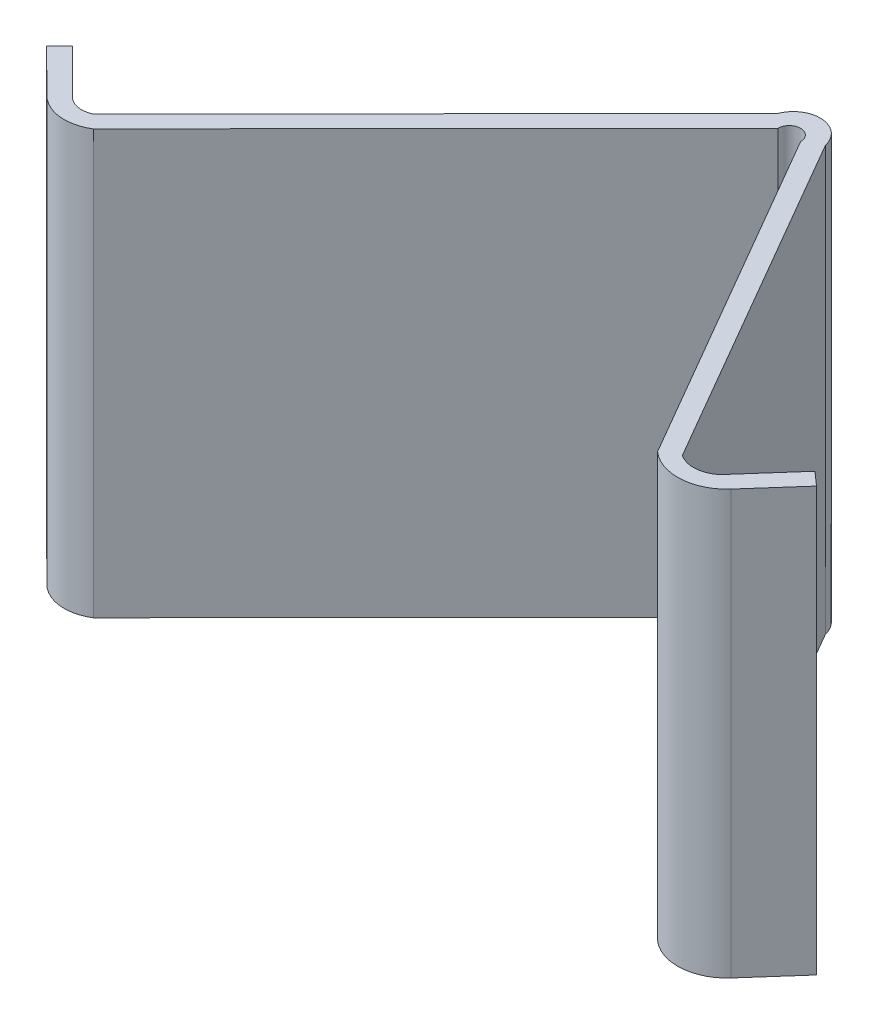
ISO-10303-21;
HEADER;
FILE_DESCRIPTION(('STEP AP214'),'2;1');
FILE_NAME('part.step','',(''),(''),'','','');
FILE_SCHEMA(('AUTOMOTIVE_DESIGN { 1 0 10303 214 1 1 1 1 }'));
ENDSEC;
DATA;
#1=APPLICATION_CONTEXT('core data for automotive mechanical design processes');
#2=APPLICATION_PROTOCOL_DEFINITION('international standard','automotive_design',2000,#1);
#3=PRODUCT_CONTEXT('',#1,'mechanical');
#4=PRODUCT('Part','Part','',(#3));
#5=PRODUCT_RELATED_PRODUCT_CATEGORY('part','',(#4));
#6=PRODUCT_DEFINITION_FORMATION('','',#4);
#7=PRODUCT_DEFINITION_CONTEXT('part definition',#1,'design');
#8=PRODUCT_DEFINITION('design','',#6,#7);
#9=PRODUCT_DEFINITION_SHAPE('','',#8);
#10=(LENGTH_UNIT() NAMED_UNIT(*) SI_UNIT(.MILLI.,.METRE.));
#11=(NAMED_UNIT(*) PLANE_ANGLE_UNIT() SI_UNIT($,.RADIAN.));
#12=(NAMED_UNIT(*) SI_UNIT($,.STERADIAN.) SOLID_ANGLE_UNIT());
#13=UNCERTAINTY_MEASURE_WITH_UNIT(LENGTH_MEASURE(1.E-05),#10,'distance_accuracy_value','');
#14=(GEOMETRIC_REPRESENTATION_CONTEXT(3) GLOBAL_UNCERTAINTY_ASSIGNED_CONTEXT((#13)) GLOBAL_UNIT_ASSIGNED_CONTEXT((#10,
#11,#12)) REPRESENTATION_CONTEXT('',''));
#15=CARTESIAN_POINT('',(0.,0.,0.));
#16=DIRECTION('',(0.,0.,1.));
#17=DIRECTION('',(1.,0.,0.));
#18=AXIS2_PLACEMENT_3D('',#15,#16,#17);
#19=CARTESIAN_POINT('',(-1.37972752963532,70.,-1.37563338266311));
#20=DIRECTION('',(-0.708156678158469,0.,-0.7060553230304));
#21=DIRECTION('',(-0.7060553230304,0.,0.708156678158469));
#22=AXIS2_PLACEMENT_3D('',#19,#20,#21);
#23=PLANE('',#22);
#24=DIRECTION('',(0.7060553230304,0.,-0.708156678158469));
#25=VECTOR('',#24,1.);
#26=CARTESIAN_POINT('',(-1.37972752963532,0.,-1.37563338266311));
#27=LINE('',#26,#25);
#28=CARTESIAN_POINT('',(-43.3633685392197,0.,40.73295893945));
#29=VERTEX_POINT('',#28);
#30=CARTESIAN_POINT('',(13.1210573032123,0.,-15.9195753132276));
#31=VERTEX_POINT('',#30);
#32=EDGE_CURVE('E478',#29,#31,#27,.T.);
#33=ORIENTED_EDGE('',*,*,#32,.T.);
#34=DIRECTION('',(0.,-1.,0.));
#35=VECTOR('',#34,1.);
#36=CARTESIAN_POINT('',(13.1210573032123,70.,-15.9195753132276));
#37=LINE('',#36,#35);
#38=CARTESIAN_POINT('',(13.1210573032123,70.,-15.9195753132276));
#39=VERTEX_POINT('',#38);
#40=EDGE_CURVE('E457',#39,#31,#37,.T.);
#41=ORIENTED_EDGE('',*,*,#40,.F.);
#42=DIRECTION('',(0.7060553230304,0.,-0.708156678158469));
#43=VECTOR('',#42,1.);
#44=CARTESIAN_POINT('',(-1.37972752963532,70.,-1.37563338266311));
#45=LINE('',#44,#43);
#46=CARTESIAN_POINT('',(-43.3633685392197,70.,40.73295893945));
#47=VERTEX_POINT('',#46);
#48=EDGE_CURVE('E477',#47,#39,#45,.T.);
#49=ORIENTED_EDGE('',*,*,#48,.F.);
#50=DIRECTION('',(0.,-1.,0.));
#51=VECTOR('',#50,1.);
#52=CARTESIAN_POINT('',(-43.3633685392197,70.,40.73295893945));
#53=LINE('',#52,#51);
#54=EDGE_CURVE('E282',#47,#29,#53,.T.);
#55=ORIENTED_EDGE('',*,*,#54,.T.);
#56=EDGE_LOOP('',(#33,#41,#49,#55));
#57=FACE_BOUND('',#56,.T.);
#58=ADVANCED_FACE('F263',(#57),#23,.F.);
#59=CARTESIAN_POINT('',(-3.50419756411074,70.,-3.49379935175431));
#60=DIRECTION('',(-0.708156678158469,0.,-0.7060553230304));
#61=DIRECTION('',(-0.7060553230304,0.,0.708156678158469));
#62=AXIS2_PLACEMENT_3D('',#59,#60,#61);
#63=PLANE('',#62);
#64=DIRECTION('',(0.7060553230304,0.,-0.708156678158469));
#65=VECTOR('',#64,1.);
#66=CARTESIAN_POINT('',(-3.50419756411074,0.,-3.49379935175431));
#67=LINE('',#66,#65);
#68=CARTESIAN_POINT('',(-45.4878385736951,0.,38.6147929703588));
#69=VERTEX_POINT('',#68);
#70=CARTESIAN_POINT('',(10.9965872687369,0.,-18.0377412823188));
#71=VERTEX_POINT('',#70);
#72=EDGE_CURVE('E454',#69,#71,#67,.T.);
#73=ORIENTED_EDGE('',*,*,#72,.F.);
#74=DIRECTION('',(0.,-1.,0.));
#75=VECTOR('',#74,1.);
#76=CARTESIAN_POINT('',(-45.4878385736951,70.,38.6147929703588));
#77=LINE('',#76,#75);
#78=CARTESIAN_POINT('',(-45.4878385736951,70.,38.6147929703588));
#79=VERTEX_POINT('',#78);
#80=EDGE_CURVE('E273',#79,#69,#77,.T.);
#81=ORIENTED_EDGE('',*,*,#80,.F.);
#82=DIRECTION('',(0.7060553230304,0.,-0.708156678158469));
#83=VECTOR('',#82,1.);
#84=CARTESIAN_POINT('',(-3.50419756411074,70.,-3.49379935175431));
#85=LINE('',#84,#83);
#86=CARTESIAN_POINT('',(10.9965872687369,70.,-18.0377412823188));
#87=VERTEX_POINT('',#86);
#88=EDGE_CURVE('E480',#79,#87,#85,.T.);
#89=ORIENTED_EDGE('',*,*,#88,.T.);
#90=DIRECTION('',(0.,-1.,0.));
#91=VECTOR('',#90,1.);
#92=CARTESIAN_POINT('',(10.9965872687369,70.,-18.0377412823188));
#93=LINE('',#92,#91);
#94=EDGE_CURVE('E12',#87,#71,#93,.T.);
#95=ORIENTED_EDGE('',*,*,#94,.T.);
#96=EDGE_LOOP('',(#73,#81,#89,#95));
#97=FACE_BOUND('',#96,.T.);
#98=ADVANCED_FACE('F499',(#97),#63,.T.);
#99=CARTESIAN_POINT('',(-47.1014105514273,70.,34.8767509581333));
#100=DIRECTION('',(0.,-1.,0.));
#101=DIRECTION('',(0.,0.,-1.));
#102=AXIS2_PLACEMENT_3D('',#99,#100,#101);
#103=CYLINDRICAL_SURFACE('',#102,6.94752689850618);
#104=CARTESIAN_POINT('',(-47.1014105514273,0.,34.8767509581333));
#105=DIRECTION('',(0.,1.,0.));
#106=DIRECTION('',(0.,0.,1.));
#107=AXIS2_PLACEMENT_3D('',#104,#105,#106);
#108=CIRCLE('',#107,6.94752689850618);
#109=CARTESIAN_POINT('',(-52.0067489000145,0.,39.7966885279961));
#110=VERTEX_POINT('',#109);
#111=EDGE_CURVE('E481',#29,#110,#108,.F.);
#112=ORIENTED_EDGE('',*,*,#111,.F.);
#113=ORIENTED_EDGE('',*,*,#54,.F.);
#114=CARTESIAN_POINT('',(-47.1014105514273,70.,34.8767509581333));
#115=DIRECTION('',(0.,1.,0.));
#116=DIRECTION('',(0.,0.,1.));
#117=AXIS2_PLACEMENT_3D('',#114,#115,#116);
#118=CIRCLE('',#117,6.94752689850618);
#119=CARTESIAN_POINT('',(-52.0067489000145,70.,39.7966885279961));
#120=VERTEX_POINT('',#119);
#121=EDGE_CURVE('E489',#47,#120,#118,.F.);
#122=ORIENTED_EDGE('',*,*,#121,.T.);
#123=DIRECTION('',(0.,-1.,0.));
#124=VECTOR('',#123,1.);
#125=CARTESIAN_POINT('',(-52.0067489000145,70.,39.7966885279961));
#126=LINE('',#125,#124);
#127=EDGE_CURVE('E474',#120,#110,#126,.T.);
#128=ORIENTED_EDGE('',*,*,#127,.T.);
#129=EDGE_LOOP('',(#112,#113,#122,#128));
#130=FACE_BOUND('',#129,.T.);
#131=ADVANCED_FACE('F526',(#130),#103,.T.);
#132=CARTESIAN_POINT('',(-47.0795581582017,70.,35.301794509272));
#133=DIRECTION('',(0.,-1.,0.));
#134=DIRECTION('',(0.,0.,-1.));
#135=AXIS2_PLACEMENT_3D('',#132,#133,#134);
#136=CYLINDRICAL_SURFACE('',#135,3.67553125940526);
#137=CARTESIAN_POINT('',(-47.0795581582017,0.,35.301794509272));
#138=DIRECTION('',(0.,1.,0.));
#139=DIRECTION('',(0.,0.,1.));
#140=AXIS2_PLACEMENT_3D('',#137,#138,#139);
#141=CIRCLE('',#140,3.67553125940526);
#142=CARTESIAN_POINT('',(-49.8885829309233,0.,37.6722184935206));
#143=VERTEX_POINT('',#142);
#144=EDGE_CURVE('E484',#143,#69,#141,.T.);
#145=ORIENTED_EDGE('',*,*,#144,.F.);
#146=DIRECTION('',(0.,-1.,0.));
#147=VECTOR('',#146,1.);
#148=CARTESIAN_POINT('',(-49.8885829309233,70.,37.6722184935206));
#149=LINE('',#148,#147);
#150=CARTESIAN_POINT('',(-49.8885829309233,70.,37.6722184935206));
#151=VERTEX_POINT('',#150);
#152=EDGE_CURVE('E472',#151,#143,#149,.T.);
#153=ORIENTED_EDGE('',*,*,#152,.F.);
#154=CARTESIAN_POINT('',(-47.0795581582017,70.,35.301794509272));
#155=DIRECTION('',(0.,1.,0.));
#156=DIRECTION('',(0.,0.,1.));
#157=AXIS2_PLACEMENT_3D('',#154,#155,#156);
#158=CIRCLE('',#157,3.67553125940526);
#159=EDGE_CURVE('E491',#151,#79,#158,.T.);
#160=ORIENTED_EDGE('',*,*,#159,.T.);
#161=ORIENTED_EDGE('',*,*,#80,.T.);
#162=EDGE_LOOP('',(#145,#153,#160,#161));
#163=FACE_BOUND('',#162,.T.);
#164=ADVANCED_FACE('F513',(#163),#136,.F.);
#165=CARTESIAN_POINT('',(0.,0.,0.));
#166=DIRECTION('',(0.,1.,0.));
#167=DIRECTION('',(0.,0.,1.));
#168=AXIS2_PLACEMENT_3D('',#165,#166,#167);
#169=PLANE('',#168);
#170=ORIENTED_EDGE('',*,*,#144,.T.);
#171=ORIENTED_EDGE('',*,*,#72,.T.);
#172=CARTESIAN_POINT('',(15.1528221863756,0.,-16.4480817857646));
#173=DIRECTION('',(0.,1.,0.));
#174=DIRECTION('',(0.,0.,1.));
#175=AXIS2_PLACEMENT_3D('',#172,#173,#174);
#176=CIRCLE('',#175,4.44986584130173);
#177=CARTESIAN_POINT('',(19.4944801510169,0.,-17.4234340932158));
#178=VERTEX_POINT('',#177);
#179=EDGE_CURVE('E461',#178,#71,#176,.T.);
#180=ORIENTED_EDGE('',*,*,#179,.F.);
#181=DIRECTION('',(0.501286259996058,0.,0.865281506527884));
#182=VECTOR('',#181,1.);
#183=CARTESIAN_POINT('',(22.1532324220866,0.,-12.83410190084));
#184=LINE('',#183,#182);
#185=CARTESIAN_POINT('',(52.0780870507607,0.,38.8198638310967));
#186=VERTEX_POINT('',#185);
#187=EDGE_CURVE('E432',#178,#186,#184,.T.);
#188=ORIENTED_EDGE('',*,*,#187,.T.);
#189=CARTESIAN_POINT('',(54.742084179433,0.,34.7879503258305));
#190=DIRECTION('',(0.,1.,0.));
#191=DIRECTION('',(0.,0.,1.));
#192=AXIS2_PLACEMENT_3D('',#189,#190,#191);
#193=CIRCLE('',#192,4.83251561979071);
#194=CARTESIAN_POINT('',(58.6689987900577,0.,37.6044284202567));
#195=VERTEX_POINT('',#194);
#196=EDGE_CURVE('E392',#186,#195,#193,.T.);
#197=ORIENTED_EDGE('',*,*,#196,.T.);
#198=DIRECTION('',(0.662657885771109,0.,-0.748922243243826));
#199=VECTOR('',#198,1.);
#200=CARTESIAN_POINT('',(58.6689987900577,0.,37.6044284202567));
#201=LINE('',#200,#199);
#202=CARTESIAN_POINT('',(65.2955776477688,0.,30.1152059878184));
#203=VERTEX_POINT('',#202);
#204=EDGE_CURVE('E376',#195,#203,#201,.T.);
#205=ORIENTED_EDGE('',*,*,#204,.T.);
#206=DIRECTION('',(0.748922243243827,0.,0.662657885771107));
#207=VECTOR('',#206,1.);
#208=CARTESIAN_POINT('',(65.2955776477688,0.,30.1152059878184));
#209=LINE('',#208,#207);
#210=CARTESIAN_POINT('',(67.5423443775003,0.,32.1031796451317));
#211=VERTEX_POINT('',#210);
#212=EDGE_CURVE('E383',#203,#211,#209,.T.);
#213=ORIENTED_EDGE('',*,*,#212,.T.);
#214=DIRECTION('',(0.662657885771111,0.,-0.748922243243824));
#215=VECTOR('',#214,1.);
#216=CARTESIAN_POINT('',(60.9157655197892,0.,39.59240207757));
#217=LINE('',#216,#215);
#218=CARTESIAN_POINT('',(60.9157655197892,0.,39.59240207757));
#219=VERTEX_POINT('',#218);
#220=EDGE_CURVE('E386',#219,#211,#217,.T.);
#221=ORIENTED_EDGE('',*,*,#220,.F.);
#222=CARTESIAN_POINT('',(54.8312610227236,0.,34.2087391908511));
#223=DIRECTION('',(0.,1.,0.));
#224=DIRECTION('',(0.,0.,1.));
#225=AXIS2_PLACEMENT_3D('',#222,#223,#224);
#226=CIRCLE('',#225,8.12434742318689);
#227=CARTESIAN_POINT('',(49.4822425311771,0.,40.3237226110849));
#228=VERTEX_POINT('',#227);
#229=EDGE_CURVE('E436',#228,#219,#226,.T.);
#230=ORIENTED_EDGE('',*,*,#229,.F.);
#231=DIRECTION('',(0.501286259996058,0.,0.865281506527884));
#232=VECTOR('',#231,1.);
#233=CARTESIAN_POINT('',(19.5573879025029,0.,-11.3302431208518));
#234=LINE('',#233,#232);
#235=CARTESIAN_POINT('',(16.8986356314333,0.,-15.9195753132276));
#236=VERTEX_POINT('',#235);
#237=EDGE_CURVE('E403',#236,#228,#234,.T.);
#238=ORIENTED_EDGE('',*,*,#237,.F.);
#239=CARTESIAN_POINT('',(15.0098464673228,0.,-15.9195753132276));
#240=DIRECTION('',(0.,1.,0.));
#241=DIRECTION('',(0.,0.,1.));
#242=AXIS2_PLACEMENT_3D('',#239,#240,#241);
#243=CIRCLE('',#242,1.88878916411049);
#244=EDGE_CURVE('E424',#236,#31,#243,.T.);
#245=ORIENTED_EDGE('',*,*,#244,.T.);
#246=ORIENTED_EDGE('',*,*,#32,.F.);
#247=ORIENTED_EDGE('',*,*,#111,.T.);
#248=DIRECTION('',(-0.708156678158472,0.,-0.706055323030397));
#249=VECTOR('',#248,1.);
#250=CARTESIAN_POINT('',(-52.0067489000145,0.,39.796688527996));
#251=LINE('',#250,#249);
#252=CARTESIAN_POINT('',(-59.0883156815992,0.,32.7361352976921));
#253=VERTEX_POINT('',#252);
#254=EDGE_CURVE('E407',#110,#253,#251,.T.);
#255=ORIENTED_EDGE('',*,*,#254,.T.);
#256=DIRECTION('',(0.706055323030398,0.,-0.708156678158471));
#257=VECTOR('',#256,1.);
#258=CARTESIAN_POINT('',(-59.0883156815992,0.,32.7361352976921));
#259=LINE('',#258,#257);
#260=CARTESIAN_POINT('',(-56.970149712508,0.,30.6116652632167));
#261=VERTEX_POINT('',#260);
#262=EDGE_CURVE('E411',#253,#261,#259,.T.);
#263=ORIENTED_EDGE('',*,*,#262,.T.);
#264=DIRECTION('',(-0.708156678158472,0.,-0.706055323030397));
#265=VECTOR('',#264,1.);
#266=CARTESIAN_POINT('',(-49.8885829309233,0.,37.6722184935206));
#267=LINE('',#266,#265);
#268=EDGE_CURVE('E381',#143,#261,#267,.T.);
#269=ORIENTED_EDGE('',*,*,#268,.F.);
#270=EDGE_LOOP('',(#170,#171,#180,#188,#197,#205,#213,#221,#230,#238,#245,#246,#247,#255,#263,#269));
#271=FACE_BOUND('',#270,.T.);
#272=ADVANCED_FACE('F389',(#271),#169,.F.);
#273=CARTESIAN_POINT('',(0.,70.,0.));
#274=DIRECTION('',(0.,1.,0.));
#275=DIRECTION('',(0.,0.,1.));
#276=AXIS2_PLACEMENT_3D('',#273,#274,#275);
#277=PLANE('',#276);
#278=ORIENTED_EDGE('',*,*,#121,.F.);
#279=ORIENTED_EDGE('',*,*,#48,.T.);
#280=CARTESIAN_POINT('',(15.0098464673228,70.,-15.9195753132276));
#281=DIRECTION('',(0.,1.,0.));
#282=DIRECTION('',(0.,0.,1.));
#283=AXIS2_PLACEMENT_3D('',#280,#281,#282);
#284=CIRCLE('',#283,1.88878916411049);
#285=CARTESIAN_POINT('',(16.8986356314333,70.,-15.9195753132276));
#286=VERTEX_POINT('',#285);
#287=EDGE_CURVE('E464',#286,#39,#284,.T.);
#288=ORIENTED_EDGE('',*,*,#287,.F.);
#289=DIRECTION('',(0.501286259996058,0.,0.865281506527884));
#290=VECTOR('',#289,1.);
#291=CARTESIAN_POINT('',(19.5573879025029,70.,-11.3302431208518));
#292=LINE('',#291,#290);
#293=CARTESIAN_POINT('',(49.4822425311771,70.,40.3237226110849));
#294=VERTEX_POINT('',#293);
#295=EDGE_CURVE('E434',#286,#294,#292,.T.);
#296=ORIENTED_EDGE('',*,*,#295,.T.);
#297=CARTESIAN_POINT('',(54.8312610227236,70.,34.2087391908511));
#298=DIRECTION('',(0.,1.,0.));
#299=DIRECTION('',(0.,0.,1.));
#300=AXIS2_PLACEMENT_3D('',#297,#298,#299);
#301=CIRCLE('',#300,8.12434742318689);
#302=CARTESIAN_POINT('',(60.9157655197892,70.,39.59240207757));
#303=VERTEX_POINT('',#302);
#304=EDGE_CURVE('E446',#294,#303,#301,.T.);
#305=ORIENTED_EDGE('',*,*,#304,.T.);
#306=DIRECTION('',(0.662657885771111,0.,-0.748922243243824));
#307=VECTOR('',#306,1.);
#308=CARTESIAN_POINT('',(60.9157655197892,70.,39.59240207757));
#309=LINE('',#308,#307);
#310=CARTESIAN_POINT('',(67.5423443775003,70.,32.1031796451317));
#311=VERTEX_POINT('',#310);
#312=EDGE_CURVE('E395',#303,#311,#309,.T.);
#313=ORIENTED_EDGE('',*,*,#312,.T.);
#314=DIRECTION('',(0.748922243243827,0.,0.662657885771107));
#315=VECTOR('',#314,1.);
#316=CARTESIAN_POINT('',(65.2955776477688,70.,30.1152059878184));
#317=LINE('',#316,#315);
#318=CARTESIAN_POINT('',(65.2955776477688,70.,30.1152059878184));
#319=VERTEX_POINT('',#318);
#320=EDGE_CURVE('E393',#319,#311,#317,.T.);
#321=ORIENTED_EDGE('',*,*,#320,.F.);
#322=DIRECTION('',(0.662657885771109,0.,-0.748922243243826));
#323=VECTOR('',#322,1.);
#324=CARTESIAN_POINT('',(58.6689987900577,70.,37.6044284202567));
#325=LINE('',#324,#323);
#326=CARTESIAN_POINT('',(58.6689987900577,70.,37.6044284202567));
#327=VERTEX_POINT('',#326);
#328=EDGE_CURVE('E379',#327,#319,#325,.T.);
#329=ORIENTED_EDGE('',*,*,#328,.F.);
#330=CARTESIAN_POINT('',(54.742084179433,70.,34.7879503258305));
#331=DIRECTION('',(0.,1.,0.));
#332=DIRECTION('',(0.,0.,1.));
#333=AXIS2_PLACEMENT_3D('',#330,#331,#332);
#334=CIRCLE('',#333,4.83251561979071);
#335=CARTESIAN_POINT('',(52.0780870507607,70.,38.8198638310967));
#336=VERTEX_POINT('',#335);
#337=EDGE_CURVE('E443',#336,#327,#334,.T.);
#338=ORIENTED_EDGE('',*,*,#337,.F.);
#339=DIRECTION('',(0.501286259996058,0.,0.865281506527884));
#340=VECTOR('',#339,1.);
#341=CARTESIAN_POINT('',(22.1532324220866,70.,-12.83410190084));
#342=LINE('',#341,#340);
#343=CARTESIAN_POINT('',(19.4944801510169,70.,-17.4234340932158));
#344=VERTEX_POINT('',#343);
#345=EDGE_CURVE('E431',#344,#336,#342,.T.);
#346=ORIENTED_EDGE('',*,*,#345,.F.);
#347=CARTESIAN_POINT('',(15.1528221863756,70.,-16.4480817857646));
#348=DIRECTION('',(0.,1.,0.));
#349=DIRECTION('',(0.,0.,1.));
#350=AXIS2_PLACEMENT_3D('',#347,#348,#349);
#351=CIRCLE('',#350,4.44986584130173);
#352=EDGE_CURVE('E460',#344,#87,#351,.T.);
#353=ORIENTED_EDGE('',*,*,#352,.T.);
#354=ORIENTED_EDGE('',*,*,#88,.F.);
#355=ORIENTED_EDGE('',*,*,#159,.F.);
#356=DIRECTION('',(-0.708156678158472,0.,-0.706055323030397));
#357=VECTOR('',#356,1.);
#358=CARTESIAN_POINT('',(-49.8885829309233,70.,37.6722184935206));
#359=LINE('',#358,#357);
#360=CARTESIAN_POINT('',(-56.970149712508,70.,30.6116652632167));
#361=VERTEX_POINT('',#360);
#362=EDGE_CURVE('E410',#151,#361,#359,.T.);
#363=ORIENTED_EDGE('',*,*,#362,.T.);
#364=DIRECTION('',(0.706055323030398,0.,-0.708156678158471));
#365=VECTOR('',#364,1.);
#366=CARTESIAN_POINT('',(-59.0883156815992,70.,32.7361352976921));
#367=LINE('',#366,#365);
#368=CARTESIAN_POINT('',(-59.0883156815992,70.,32.7361352976921));
#369=VERTEX_POINT('',#368);
#370=EDGE_CURVE('E418',#369,#361,#367,.T.);
#371=ORIENTED_EDGE('',*,*,#370,.F.);
#372=DIRECTION('',(-0.708156678158472,0.,-0.706055323030397));
#373=VECTOR('',#372,1.);
#374=CARTESIAN_POINT('',(-52.0067489000145,70.,39.796688527996));
#375=LINE('',#374,#373);
#376=EDGE_CURVE('E406',#120,#369,#375,.T.);
#377=ORIENTED_EDGE('',*,*,#376,.F.);
#378=EDGE_LOOP('',(#278,#279,#288,#296,#305,#313,#321,#329,#338,#346,#353,#354,#355,#363,#371,#377));
#379=FACE_BOUND('',#378,.T.);
#380=ADVANCED_FACE('F506',(#379),#277,.T.);
#381=CARTESIAN_POINT('',(-59.0883156815992,70.,32.7361352976921));
#382=DIRECTION('',(-0.708156678158471,0.,-0.706055323030398));
#383=DIRECTION('',(-0.706055323030398,0.,0.708156678158471));
#384=AXIS2_PLACEMENT_3D('',#381,#382,#383);
#385=PLANE('',#384);
#386=ORIENTED_EDGE('',*,*,#262,.F.);
#387=DIRECTION('',(0.,-1.,0.));
#388=VECTOR('',#387,1.);
#389=CARTESIAN_POINT('',(-59.0883156815992,70.,32.7361352976921));
#390=LINE('',#389,#388);
#391=EDGE_CURVE('E404',#369,#253,#390,.T.);
#392=ORIENTED_EDGE('',*,*,#391,.F.);
#393=ORIENTED_EDGE('',*,*,#370,.T.);
#394=DIRECTION('',(0.,-1.,0.));
#395=VECTOR('',#394,1.);
#396=CARTESIAN_POINT('',(-56.970149712508,70.,30.6116652632167));
#397=LINE('',#396,#395);
#398=EDGE_CURVE('E401',#361,#261,#397,.T.);
#399=ORIENTED_EDGE('',*,*,#398,.T.);
#400=EDGE_LOOP('',(#386,#392,#393,#399));
#401=FACE_BOUND('',#400,.T.);
#402=ADVANCED_FACE('F553',(#401),#385,.T.);
#403=CARTESIAN_POINT('',(-52.0067489000145,70.,39.796688527996));
#404=DIRECTION('',(-0.706055323030397,0.,0.708156678158472));
#405=DIRECTION('',(0.708156678158472,0.,0.706055323030397));
#406=AXIS2_PLACEMENT_3D('',#403,#404,#405);
#407=PLANE('',#406);
#408=ORIENTED_EDGE('',*,*,#254,.F.);
#409=ORIENTED_EDGE('',*,*,#127,.F.);
#410=ORIENTED_EDGE('',*,*,#376,.T.);
#411=ORIENTED_EDGE('',*,*,#391,.T.);
#412=EDGE_LOOP('',(#408,#409,#410,#411));
#413=FACE_BOUND('',#412,.T.);
#414=ADVANCED_FACE('F524',(#413),#407,.T.);
#415=CARTESIAN_POINT('',(-49.8885829309233,70.,37.6722184935206));
#416=DIRECTION('',(-0.706055323030397,0.,0.708156678158472));
#417=DIRECTION('',(0.708156678158472,0.,0.706055323030397));
#418=AXIS2_PLACEMENT_3D('',#415,#416,#417);
#419=PLANE('',#418);
#420=ORIENTED_EDGE('',*,*,#268,.T.);
#421=ORIENTED_EDGE('',*,*,#398,.F.);
#422=ORIENTED_EDGE('',*,*,#362,.F.);
#423=ORIENTED_EDGE('',*,*,#152,.T.);
#424=EDGE_LOOP('',(#420,#421,#422,#423));
#425=FACE_BOUND('',#424,.T.);
#426=ADVANCED_FACE('F518',(#425),#419,.F.);
#427=CARTESIAN_POINT('',(60.9157655197892,70.,39.59240207757));
#428=DIRECTION('',(-0.748922243243824,0.,-0.662657885771111));
#429=DIRECTION('',(-0.662657885771111,0.,0.748922243243824));
#430=AXIS2_PLACEMENT_3D('',#427,#428,#429);
#431=PLANE('',#430);
#432=ORIENTED_EDGE('',*,*,#220,.T.);
#433=DIRECTION('',(0.,-1.,0.));
#434=VECTOR('',#433,1.);
#435=CARTESIAN_POINT('',(67.5423443775003,70.,32.1031796451317));
#436=LINE('',#435,#434);
#437=EDGE_CURVE('E267',#311,#211,#436,.T.);
#438=ORIENTED_EDGE('',*,*,#437,.F.);
#439=ORIENTED_EDGE('',*,*,#312,.F.);
#440=DIRECTION('',(0.,-1.,0.));
#441=VECTOR('',#440,1.);
#442=CARTESIAN_POINT('',(60.9157655197892,70.,39.59240207757));
#443=LINE('',#442,#441);
#444=EDGE_CURVE('E425',#303,#219,#443,.T.);
#445=ORIENTED_EDGE('',*,*,#444,.T.);
#446=EDGE_LOOP('',(#432,#438,#439,#445));
#447=FACE_BOUND('',#446,.T.);
#448=ADVANCED_FACE('F543',(#447),#431,.F.);
#449=CARTESIAN_POINT('',(65.2955776477688,70.,30.1152059878184));
#450=DIRECTION('',(0.662657885771107,0.,-0.748922243243827));
#451=DIRECTION('',(-0.748922243243827,0.,-0.662657885771107));
#452=AXIS2_PLACEMENT_3D('',#449,#450,#451);
#453=PLANE('',#452);
#454=ORIENTED_EDGE('',*,*,#212,.F.);
#455=DIRECTION('',(0.,-1.,0.));
#456=VECTOR('',#455,1.);
#457=CARTESIAN_POINT('',(65.2955776477688,70.,30.1152059878184));
#458=LINE('',#457,#456);
#459=EDGE_CURVE('E373',#319,#203,#458,.T.);
#460=ORIENTED_EDGE('',*,*,#459,.F.);
#461=ORIENTED_EDGE('',*,*,#320,.T.);
#462=ORIENTED_EDGE('',*,*,#437,.T.);
#463=EDGE_LOOP('',(#454,#460,#461,#462));
#464=FACE_BOUND('',#463,.T.);
#465=ADVANCED_FACE('F265',(#464),#453,.T.);
#466=CARTESIAN_POINT('',(54.8312610227236,70.,34.2087391908511));
#467=DIRECTION('',(0.,-1.,0.));
#468=DIRECTION('',(0.,0.,-1.));
#469=AXIS2_PLACEMENT_3D('',#466,#467,#468);
#470=CYLINDRICAL_SURFACE('',#469,8.12434742318689);
#471=ORIENTED_EDGE('',*,*,#229,.T.);
#472=ORIENTED_EDGE('',*,*,#444,.F.);
#473=ORIENTED_EDGE('',*,*,#304,.F.);
#474=DIRECTION('',(0.,-1.,0.));
#475=VECTOR('',#474,1.);
#476=CARTESIAN_POINT('',(49.4822425311771,70.,40.3237226110849));
#477=LINE('',#476,#475);
#478=EDGE_CURVE('E422',#294,#228,#477,.T.);
#479=ORIENTED_EDGE('',*,*,#478,.T.);
#480=EDGE_LOOP('',(#471,#472,#473,#479));
#481=FACE_BOUND('',#480,.T.);
#482=ADVANCED_FACE('F540',(#481),#470,.T.);
#483=CARTESIAN_POINT('',(58.6689987900577,70.,37.6044284202567));
#484=DIRECTION('',(-0.748922243243826,0.,-0.662657885771109));
#485=DIRECTION('',(-0.662657885771109,0.,0.748922243243826));
#486=AXIS2_PLACEMENT_3D('',#483,#484,#485);
#487=PLANE('',#486);
#488=ORIENTED_EDGE('',*,*,#204,.F.);
#489=DIRECTION('',(0.,-1.,0.));
#490=VECTOR('',#489,1.);
#491=CARTESIAN_POINT('',(58.6689987900577,70.,37.6044284202567));
#492=LINE('',#491,#490);
#493=EDGE_CURVE('E427',#327,#195,#492,.T.);
#494=ORIENTED_EDGE('',*,*,#493,.F.);
#495=ORIENTED_EDGE('',*,*,#328,.T.);
#496=ORIENTED_EDGE('',*,*,#459,.T.);
#497=EDGE_LOOP('',(#488,#494,#495,#496));
#498=FACE_BOUND('',#497,.T.);
#499=ADVANCED_FACE('F374',(#498),#487,.T.);
#500=CARTESIAN_POINT('',(19.5573879025029,70.,-11.3302431208518));
#501=DIRECTION('',(0.865281506527884,0.,-0.501286259996058));
#502=DIRECTION('',(-0.501286259996058,0.,-0.865281506527884));
#503=AXIS2_PLACEMENT_3D('',#500,#501,#502);
#504=PLANE('',#503);
#505=ORIENTED_EDGE('',*,*,#237,.T.);
#506=ORIENTED_EDGE('',*,*,#478,.F.);
#507=ORIENTED_EDGE('',*,*,#295,.F.);
#508=DIRECTION('',(0.,-1.,0.));
#509=VECTOR('',#508,1.);
#510=CARTESIAN_POINT('',(16.8986356314333,70.,-15.9195753132276));
#511=LINE('',#510,#509);
#512=EDGE_CURVE('E451',#286,#236,#511,.T.);
#513=ORIENTED_EDGE('',*,*,#512,.T.);
#514=EDGE_LOOP('',(#505,#506,#507,#513));
#515=FACE_BOUND('',#514,.T.);
#516=ADVANCED_FACE('F536',(#515),#504,.F.);
#517=CARTESIAN_POINT('',(54.742084179433,70.,34.7879503258305));
#518=DIRECTION('',(0.,-1.,0.));
#519=DIRECTION('',(0.,0.,-1.));
#520=AXIS2_PLACEMENT_3D('',#517,#518,#519);
#521=CYLINDRICAL_SURFACE('',#520,4.83251561979071);
#522=ORIENTED_EDGE('',*,*,#196,.F.);
#523=DIRECTION('',(0.,-1.,0.));
#524=VECTOR('',#523,1.);
#525=CARTESIAN_POINT('',(52.0780870507607,70.,38.8198638310967));
#526=LINE('',#525,#524);
#527=EDGE_CURVE('E429',#336,#186,#526,.T.);
#528=ORIENTED_EDGE('',*,*,#527,.F.);
#529=ORIENTED_EDGE('',*,*,#337,.T.);
#530=ORIENTED_EDGE('',*,*,#493,.T.);
#531=EDGE_LOOP('',(#522,#528,#529,#530));
#532=FACE_BOUND('',#531,.T.);
#533=ADVANCED_FACE('F546',(#532),#521,.F.);
#534=CARTESIAN_POINT('',(22.1532324220866,70.,-12.83410190084));
#535=DIRECTION('',(0.865281506527884,0.,-0.501286259996058));
#536=DIRECTION('',(-0.501286259996058,0.,-0.865281506527884));
#537=AXIS2_PLACEMENT_3D('',#534,#535,#536);
#538=PLANE('',#537);
#539=ORIENTED_EDGE('',*,*,#187,.F.);
#540=DIRECTION('',(0.,-1.,0.));
#541=VECTOR('',#540,1.);
#542=CARTESIAN_POINT('',(19.4944801510169,70.,-17.4234340932158));
#543=LINE('',#542,#541);
#544=EDGE_CURVE('E455',#344,#178,#543,.T.);
#545=ORIENTED_EDGE('',*,*,#544,.F.);
#546=ORIENTED_EDGE('',*,*,#345,.T.);
#547=ORIENTED_EDGE('',*,*,#527,.T.);
#548=EDGE_LOOP('',(#539,#545,#546,#547));
#549=FACE_BOUND('',#548,.T.);
#550=ADVANCED_FACE('F549',(#549),#538,.T.);
#551=CARTESIAN_POINT('',(15.0098464673228,70.,-15.9195753132276));
#552=DIRECTION('',(0.,-1.,0.));
#553=DIRECTION('',(0.,0.,-1.));
#554=AXIS2_PLACEMENT_3D('',#551,#552,#553);
#555=CYLINDRICAL_SURFACE('',#554,1.88878916411049);
#556=ORIENTED_EDGE('',*,*,#244,.F.);
#557=ORIENTED_EDGE('',*,*,#512,.F.);
#558=ORIENTED_EDGE('',*,*,#287,.T.);
#559=ORIENTED_EDGE('',*,*,#40,.T.);
#560=EDGE_LOOP('',(#556,#557,#558,#559));
#561=FACE_BOUND('',#560,.T.);
#562=ADVANCED_FACE('F534',(#561),#555,.F.);
#563=CARTESIAN_POINT('',(15.1528221863756,70.,-16.4480817857646));
#564=DIRECTION('',(0.,-1.,0.));
#565=DIRECTION('',(0.,0.,-1.));
#566=AXIS2_PLACEMENT_3D('',#563,#564,#565);
#567=CYLINDRICAL_SURFACE('',#566,4.44986584130173);
#568=ORIENTED_EDGE('',*,*,#179,.T.);
#569=ORIENTED_EDGE('',*,*,#94,.F.);
#570=ORIENTED_EDGE('',*,*,#352,.F.);
#571=ORIENTED_EDGE('',*,*,#544,.T.);
#572=EDGE_LOOP('',(#568,#569,#570,#571));
#573=FACE_BOUND('',#572,.T.);
#574=ADVANCED_FACE('F552',(#573),#567,.T.);
#575=CLOSED_SHELL('',(#58,#98,#131,#164,#272,#380,#402,#414,#426,#448,#465,#482,#499,#516,#533,
#550,#562,#574));
#576=MANIFOLD_SOLID_BREP('B2',#575);
#577=ADVANCED_BREP_SHAPE_REPRESENTATION('',(#18,#576),#14);
#578=SHAPE_DEFINITION_REPRESENTATION(#9,#577);
ENDSEC;
END-ISO-10303-21;
